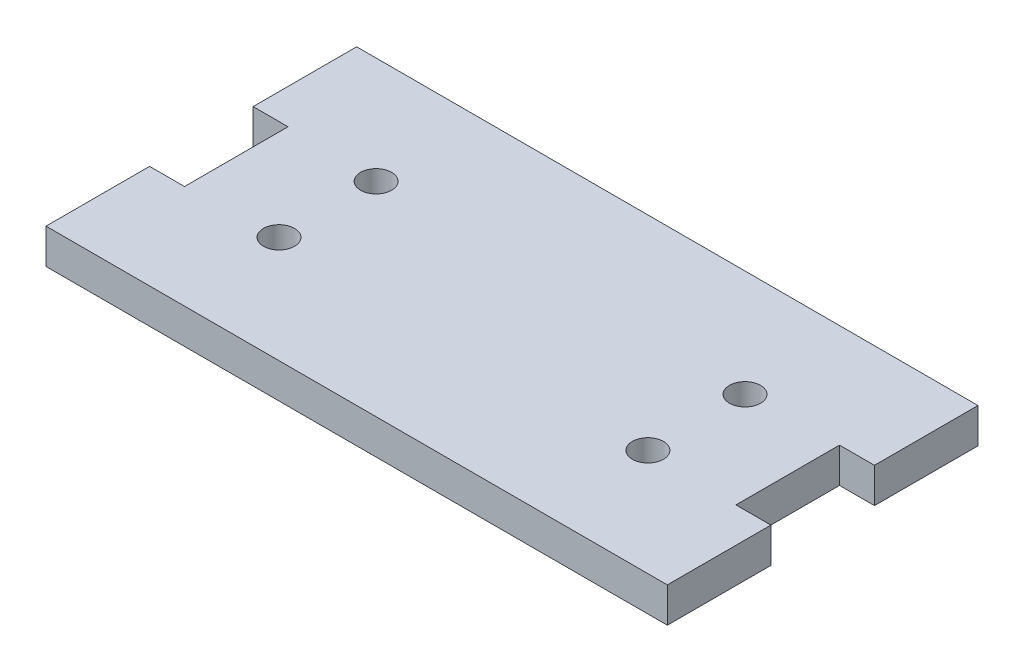
ISO-10303-21;
HEADER;
FILE_DESCRIPTION(('STEP AP214'),'2;1');
FILE_NAME('part.step','',(''),(''),'','','');
FILE_SCHEMA(('AUTOMOTIVE_DESIGN { 1 0 10303 214 1 1 1 1 }'));
ENDSEC;
DATA;
#1=APPLICATION_CONTEXT('core data for automotive mechanical design processes');
#2=APPLICATION_PROTOCOL_DEFINITION('international standard','automotive_design',2000,#1);
#3=PRODUCT_CONTEXT('',#1,'mechanical');
#4=PRODUCT('Part','Part','',(#3));
#5=PRODUCT_RELATED_PRODUCT_CATEGORY('part','',(#4));
#6=PRODUCT_DEFINITION_FORMATION('','',#4);
#7=PRODUCT_DEFINITION_CONTEXT('part definition',#1,'design');
#8=PRODUCT_DEFINITION('design','',#6,#7);
#9=PRODUCT_DEFINITION_SHAPE('','',#8);
#10=(LENGTH_UNIT() NAMED_UNIT(*) SI_UNIT(.MILLI.,.METRE.));
#11=(NAMED_UNIT(*) PLANE_ANGLE_UNIT() SI_UNIT($,.RADIAN.));
#12=(NAMED_UNIT(*) SI_UNIT($,.STERADIAN.) SOLID_ANGLE_UNIT());
#13=UNCERTAINTY_MEASURE_WITH_UNIT(LENGTH_MEASURE(1.E-05),#10,'distance_accuracy_value','');
#14=(GEOMETRIC_REPRESENTATION_CONTEXT(3) GLOBAL_UNCERTAINTY_ASSIGNED_CONTEXT((#13)) GLOBAL_UNIT_ASSIGNED_CONTEXT((#10,
#11,#12)) REPRESENTATION_CONTEXT('',''));
#15=CARTESIAN_POINT('',(0.,0.,0.));
#16=DIRECTION('',(0.,0.,1.));
#17=DIRECTION('',(1.,0.,0.));
#18=AXIS2_PLACEMENT_3D('',#15,#16,#17);
#19=CARTESIAN_POINT('',(151.,9.00000000000001,0.));
#20=DIRECTION('',(1.,0.,0.));
#21=DIRECTION('',(0.,0.,-1.));
#22=AXIS2_PLACEMENT_3D('',#19,#20,#21);
#23=PLANE('',#22);
#24=DIRECTION('',(0.,0.,1.));
#25=VECTOR('',#24,1.);
#26=CARTESIAN_POINT('',(151.,0.,0.));
#27=LINE('',#26,#25);
#28=CARTESIAN_POINT('',(151.,0.,-53.3333333333334));
#29=VERTEX_POINT('',#28);
#30=CARTESIAN_POINT('',(151.,0.,-26.6666666666666));
#31=VERTEX_POINT('',#30);
#32=EDGE_CURVE('E227',#29,#31,#27,.T.);
#33=ORIENTED_EDGE('',*,*,#32,.F.);
#34=DIRECTION('',(0.,-1.,0.));
#35=VECTOR('',#34,1.);
#36=CARTESIAN_POINT('',(151.,9.00000000000001,-53.3333333333334));
#37=LINE('',#36,#35);
#38=CARTESIAN_POINT('',(151.,9.00000000000001,-53.3333333333334));
#39=VERTEX_POINT('',#38);
#40=EDGE_CURVE('E13',#39,#29,#37,.T.);
#41=ORIENTED_EDGE('',*,*,#40,.F.);
#42=DIRECTION('',(0.,0.,1.));
#43=VECTOR('',#42,1.);
#44=CARTESIAN_POINT('',(151.,9.00000000000001,0.));
#45=LINE('',#44,#43);
#46=CARTESIAN_POINT('',(151.,9.00000000000001,-26.6666666666666));
#47=VERTEX_POINT('',#46);
#48=EDGE_CURVE('E365',#39,#47,#45,.T.);
#49=ORIENTED_EDGE('',*,*,#48,.T.);
#50=DIRECTION('',(0.,-1.,0.));
#51=VECTOR('',#50,1.);
#52=CARTESIAN_POINT('',(151.,9.00000000000001,-26.6666666666666));
#53=LINE('',#52,#51);
#54=EDGE_CURVE('E118',#47,#31,#53,.T.);
#55=ORIENTED_EDGE('',*,*,#54,.T.);
#56=EDGE_LOOP('',(#33,#41,#49,#55));
#57=FACE_BOUND('',#56,.T.);
#58=ADVANCED_FACE('F54',(#57),#23,.T.);
#59=CARTESIAN_POINT('',(2.4980018054066E-13,9.00000000000001,-53.3333333333341));
#60=DIRECTION('',(0.,0.,1.));
#61=DIRECTION('',(1.,0.,0.));
#62=AXIS2_PLACEMENT_3D('',#59,#60,#61);
#63=PLANE('',#62);
#64=DIRECTION('',(-1.,0.,0.));
#65=VECTOR('',#64,1.);
#66=CARTESIAN_POINT('',(2.4980018054066E-13,0.,-53.3333333333341));
#67=LINE('',#66,#65);
#68=CARTESIAN_POINT('',(160.,0.,-53.3333333333333));
#69=VERTEX_POINT('',#68);
#70=EDGE_CURVE('E219',#69,#29,#67,.T.);
#71=ORIENTED_EDGE('',*,*,#70,.F.);
#72=DIRECTION('',(0.,-1.,0.));
#73=VECTOR('',#72,1.);
#74=CARTESIAN_POINT('',(160.,9.00000000000001,-53.3333333333333));
#75=LINE('',#74,#73);
#76=CARTESIAN_POINT('',(160.,9.00000000000001,-53.3333333333333));
#77=VERTEX_POINT('',#76);
#78=EDGE_CURVE('E64',#77,#69,#75,.T.);
#79=ORIENTED_EDGE('',*,*,#78,.F.);
#80=DIRECTION('',(-1.,0.,0.));
#81=VECTOR('',#80,1.);
#82=CARTESIAN_POINT('',(2.4980018054066E-13,9.00000000000001,-53.3333333333341));
#83=LINE('',#82,#81);
#84=EDGE_CURVE('E370',#77,#39,#83,.T.);
#85=ORIENTED_EDGE('',*,*,#84,.T.);
#86=ORIENTED_EDGE('',*,*,#40,.T.);
#87=EDGE_LOOP('',(#71,#79,#85,#86));
#88=FACE_BOUND('',#87,.T.);
#89=ADVANCED_FACE('F225',(#88),#63,.T.);
#90=CARTESIAN_POINT('',(160.,9.00000000000001,0.));
#91=DIRECTION('',(-1.,0.,0.));
#92=DIRECTION('',(0.,0.,1.));
#93=AXIS2_PLACEMENT_3D('',#90,#91,#92);
#94=PLANE('',#93);
#95=DIRECTION('',(0.,0.,-1.));
#96=VECTOR('',#95,1.);
#97=CARTESIAN_POINT('',(160.,0.,0.));
#98=LINE('',#97,#96);
#99=CARTESIAN_POINT('',(160.,0.,-80.));
#100=VERTEX_POINT('',#99);
#101=EDGE_CURVE('E209',#69,#100,#98,.T.);
#102=ORIENTED_EDGE('',*,*,#101,.T.);
#103=DIRECTION('',(0.,-1.,0.));
#104=VECTOR('',#103,1.);
#105=CARTESIAN_POINT('',(160.,9.00000000000001,-80.));
#106=LINE('',#105,#104);
#107=CARTESIAN_POINT('',(160.,9.00000000000001,-80.));
#108=VERTEX_POINT('',#107);
#109=EDGE_CURVE('E199',#108,#100,#106,.T.);
#110=ORIENTED_EDGE('',*,*,#109,.F.);
#111=DIRECTION('',(0.,0.,-1.));
#112=VECTOR('',#111,1.);
#113=CARTESIAN_POINT('',(160.,9.00000000000001,0.));
#114=LINE('',#113,#112);
#115=EDGE_CURVE('E211',#77,#108,#114,.T.);
#116=ORIENTED_EDGE('',*,*,#115,.F.);
#117=ORIENTED_EDGE('',*,*,#78,.T.);
#118=EDGE_LOOP('',(#102,#110,#116,#117));
#119=FACE_BOUND('',#118,.T.);
#120=ADVANCED_FACE('F207',(#119),#94,.F.);
#121=CARTESIAN_POINT('',(0.,9.00000000000001,-80.));
#122=DIRECTION('',(0.,0.,-1.));
#123=DIRECTION('',(-1.,0.,0.));
#124=AXIS2_PLACEMENT_3D('',#121,#122,#123);
#125=PLANE('',#124);
#126=DIRECTION('',(1.,0.,0.));
#127=VECTOR('',#126,1.);
#128=CARTESIAN_POINT('',(0.,0.,-80.));
#129=LINE('',#128,#127);
#130=CARTESIAN_POINT('',(0.,0.,-80.));
#131=VERTEX_POINT('',#130);
#132=EDGE_CURVE('E222',#131,#100,#129,.T.);
#133=ORIENTED_EDGE('',*,*,#132,.F.);
#134=DIRECTION('',(0.,-1.,0.));
#135=VECTOR('',#134,1.);
#136=CARTESIAN_POINT('',(0.,9.00000000000001,-80.));
#137=LINE('',#136,#135);
#138=CARTESIAN_POINT('',(0.,9.00000000000001,-80.));
#139=VERTEX_POINT('',#138);
#140=EDGE_CURVE('E196',#139,#131,#137,.T.);
#141=ORIENTED_EDGE('',*,*,#140,.F.);
#142=DIRECTION('',(1.,0.,0.));
#143=VECTOR('',#142,1.);
#144=CARTESIAN_POINT('',(0.,9.00000000000001,-80.));
#145=LINE('',#144,#143);
#146=EDGE_CURVE('E378',#139,#108,#145,.T.);
#147=ORIENTED_EDGE('',*,*,#146,.T.);
#148=ORIENTED_EDGE('',*,*,#109,.T.);
#149=EDGE_LOOP('',(#133,#141,#147,#148));
#150=FACE_BOUND('',#149,.T.);
#151=ADVANCED_FACE('F318',(#150),#125,.T.);
#152=CARTESIAN_POINT('',(0.,9.00000000000001,0.));
#153=DIRECTION('',(-1.,0.,0.));
#154=DIRECTION('',(0.,0.,1.));
#155=AXIS2_PLACEMENT_3D('',#152,#153,#154);
#156=PLANE('',#155);
#157=DIRECTION('',(0.,0.,-1.));
#158=VECTOR('',#157,1.);
#159=CARTESIAN_POINT('',(0.,0.,0.));
#160=LINE('',#159,#158);
#161=CARTESIAN_POINT('',(0.,0.,-53.3333333333333));
#162=VERTEX_POINT('',#161);
#163=EDGE_CURVE('E237',#162,#131,#160,.T.);
#164=ORIENTED_EDGE('',*,*,#163,.F.);
#165=DIRECTION('',(0.,-1.,0.));
#166=VECTOR('',#165,1.);
#167=CARTESIAN_POINT('',(0.,9.00000000000001,-53.3333333333333));
#168=LINE('',#167,#166);
#169=CARTESIAN_POINT('',(0.,9.00000000000001,-53.3333333333333));
#170=VERTEX_POINT('',#169);
#171=EDGE_CURVE('E193',#170,#162,#168,.T.);
#172=ORIENTED_EDGE('',*,*,#171,.F.);
#173=DIRECTION('',(0.,0.,-1.));
#174=VECTOR('',#173,1.);
#175=CARTESIAN_POINT('',(0.,9.00000000000001,0.));
#176=LINE('',#175,#174);
#177=EDGE_CURVE('E382',#170,#139,#176,.T.);
#178=ORIENTED_EDGE('',*,*,#177,.T.);
#179=ORIENTED_EDGE('',*,*,#140,.T.);
#180=EDGE_LOOP('',(#164,#172,#178,#179));
#181=FACE_BOUND('',#180,.T.);
#182=ADVANCED_FACE('F321',(#181),#156,.T.);
#183=CARTESIAN_POINT('',(0.,9.00000000000001,-53.3333333333333));
#184=DIRECTION('',(0.,0.,-1.));
#185=DIRECTION('',(-1.,0.,0.));
#186=AXIS2_PLACEMENT_3D('',#183,#184,#185);
#187=PLANE('',#186);
#188=DIRECTION('',(1.,0.,0.));
#189=VECTOR('',#188,1.);
#190=CARTESIAN_POINT('',(0.,0.,-53.3333333333333));
#191=LINE('',#190,#189);
#192=CARTESIAN_POINT('',(9.00000000000001,0.,-53.3333333333333));
#193=VERTEX_POINT('',#192);
#194=EDGE_CURVE('E240',#162,#193,#191,.T.);
#195=ORIENTED_EDGE('',*,*,#194,.T.);
#196=DIRECTION('',(0.,-1.,0.));
#197=VECTOR('',#196,1.);
#198=CARTESIAN_POINT('',(9.00000000000001,9.00000000000001,-53.3333333333333));
#199=LINE('',#198,#197);
#200=CARTESIAN_POINT('',(9.00000000000001,9.00000000000001,-53.3333333333333));
#201=VERTEX_POINT('',#200);
#202=EDGE_CURVE('E189',#201,#193,#199,.T.);
#203=ORIENTED_EDGE('',*,*,#202,.F.);
#204=DIRECTION('',(1.,0.,0.));
#205=VECTOR('',#204,1.);
#206=CARTESIAN_POINT('',(0.,9.00000000000001,-53.3333333333333));
#207=LINE('',#206,#205);
#208=EDGE_CURVE('E386',#170,#201,#207,.T.);
#209=ORIENTED_EDGE('',*,*,#208,.F.);
#210=ORIENTED_EDGE('',*,*,#171,.T.);
#211=EDGE_LOOP('',(#195,#203,#209,#210));
#212=FACE_BOUND('',#211,.T.);
#213=ADVANCED_FACE('F325',(#212),#187,.F.);
#214=CARTESIAN_POINT('',(9.00000000000001,9.00000000000001,0.));
#215=DIRECTION('',(1.,0.,0.));
#216=DIRECTION('',(0.,0.,-1.));
#217=AXIS2_PLACEMENT_3D('',#214,#215,#216);
#218=PLANE('',#217);
#219=DIRECTION('',(0.,0.,1.));
#220=VECTOR('',#219,1.);
#221=CARTESIAN_POINT('',(9.00000000000001,0.,0.));
#222=LINE('',#221,#220);
#223=CARTESIAN_POINT('',(9.00000000000001,0.,-26.6666666666667));
#224=VERTEX_POINT('',#223);
#225=EDGE_CURVE('E244',#193,#224,#222,.T.);
#226=ORIENTED_EDGE('',*,*,#225,.T.);
#227=DIRECTION('',(0.,-1.,0.));
#228=VECTOR('',#227,1.);
#229=CARTESIAN_POINT('',(9.00000000000001,9.00000000000001,-26.6666666666667));
#230=LINE('',#229,#228);
#231=CARTESIAN_POINT('',(9.00000000000001,9.00000000000001,-26.6666666666667));
#232=VERTEX_POINT('',#231);
#233=EDGE_CURVE('E186',#232,#224,#230,.T.);
#234=ORIENTED_EDGE('',*,*,#233,.F.);
#235=DIRECTION('',(0.,0.,1.));
#236=VECTOR('',#235,1.);
#237=CARTESIAN_POINT('',(9.00000000000001,9.00000000000001,0.));
#238=LINE('',#237,#236);
#239=EDGE_CURVE('E390',#201,#232,#238,.T.);
#240=ORIENTED_EDGE('',*,*,#239,.F.);
#241=ORIENTED_EDGE('',*,*,#202,.T.);
#242=EDGE_LOOP('',(#226,#234,#240,#241));
#243=FACE_BOUND('',#242,.T.);
#244=ADVANCED_FACE('F329',(#243),#218,.F.);
#245=CARTESIAN_POINT('',(0.,9.00000000000001,-26.6666666666667));
#246=DIRECTION('',(0.,0.,-1.));
#247=DIRECTION('',(-1.,0.,0.));
#248=AXIS2_PLACEMENT_3D('',#245,#246,#247);
#249=PLANE('',#248);
#250=DIRECTION('',(1.,0.,0.));
#251=VECTOR('',#250,1.);
#252=CARTESIAN_POINT('',(0.,0.,-26.6666666666667));
#253=LINE('',#252,#251);
#254=CARTESIAN_POINT('',(0.,0.,-26.6666666666667));
#255=VERTEX_POINT('',#254);
#256=EDGE_CURVE('E248',#255,#224,#253,.T.);
#257=ORIENTED_EDGE('',*,*,#256,.F.);
#258=DIRECTION('',(0.,-1.,0.));
#259=VECTOR('',#258,1.);
#260=CARTESIAN_POINT('',(0.,9.00000000000001,-26.6666666666667));
#261=LINE('',#260,#259);
#262=CARTESIAN_POINT('',(0.,9.00000000000001,-26.6666666666667));
#263=VERTEX_POINT('',#262);
#264=EDGE_CURVE('E179',#263,#255,#261,.T.);
#265=ORIENTED_EDGE('',*,*,#264,.F.);
#266=DIRECTION('',(1.,0.,0.));
#267=VECTOR('',#266,1.);
#268=CARTESIAN_POINT('',(0.,9.00000000000001,-26.6666666666667));
#269=LINE('',#268,#267);
#270=EDGE_CURVE('E393',#263,#232,#269,.T.);
#271=ORIENTED_EDGE('',*,*,#270,.T.);
#272=ORIENTED_EDGE('',*,*,#233,.T.);
#273=EDGE_LOOP('',(#257,#265,#271,#272));
#274=FACE_BOUND('',#273,.T.);
#275=ADVANCED_FACE('F333',(#274),#249,.T.);
#276=CARTESIAN_POINT('',(0.,9.00000000000001,0.));
#277=DIRECTION('',(-1.,0.,0.));
#278=DIRECTION('',(0.,0.,1.));
#279=AXIS2_PLACEMENT_3D('',#276,#277,#278);
#280=PLANE('',#279);
#281=DIRECTION('',(0.,0.,-1.));
#282=VECTOR('',#281,1.);
#283=CARTESIAN_POINT('',(0.,0.,0.));
#284=LINE('',#283,#282);
#285=CARTESIAN_POINT('',(0.,0.,0.));
#286=VERTEX_POINT('',#285);
#287=EDGE_CURVE('E252',#286,#255,#284,.T.);
#288=ORIENTED_EDGE('',*,*,#287,.F.);
#289=DIRECTION('',(0.,-1.,0.));
#290=VECTOR('',#289,1.);
#291=CARTESIAN_POINT('',(0.,9.00000000000001,0.));
#292=LINE('',#291,#290);
#293=CARTESIAN_POINT('',(0.,9.00000000000001,0.));
#294=VERTEX_POINT('',#293);
#295=EDGE_CURVE('E174',#294,#286,#292,.T.);
#296=ORIENTED_EDGE('',*,*,#295,.F.);
#297=DIRECTION('',(0.,0.,-1.));
#298=VECTOR('',#297,1.);
#299=CARTESIAN_POINT('',(0.,9.00000000000001,0.));
#300=LINE('',#299,#298);
#301=EDGE_CURVE('E166',#294,#263,#300,.T.);
#302=ORIENTED_EDGE('',*,*,#301,.T.);
#303=ORIENTED_EDGE('',*,*,#264,.T.);
#304=EDGE_LOOP('',(#288,#296,#302,#303));
#305=FACE_BOUND('',#304,.T.);
#306=ADVANCED_FACE('F337',(#305),#280,.T.);
#307=CARTESIAN_POINT('',(0.,9.00000000000001,0.));
#308=DIRECTION('',(0.,0.,-1.));
#309=DIRECTION('',(-1.,0.,0.));
#310=AXIS2_PLACEMENT_3D('',#307,#308,#309);
#311=PLANE('',#310);
#312=DIRECTION('',(1.,0.,0.));
#313=VECTOR('',#312,1.);
#314=CARTESIAN_POINT('',(0.,0.,0.));
#315=LINE('',#314,#313);
#316=CARTESIAN_POINT('',(160.,0.,0.));
#317=VERTEX_POINT('',#316);
#318=EDGE_CURVE('E172',#286,#317,#315,.T.);
#319=ORIENTED_EDGE('',*,*,#318,.T.);
#320=DIRECTION('',(0.,-1.,0.));
#321=VECTOR('',#320,1.);
#322=CARTESIAN_POINT('',(160.,9.00000000000001,0.));
#323=LINE('',#322,#321);
#324=CARTESIAN_POINT('',(160.,9.00000000000001,0.));
#325=VERTEX_POINT('',#324);
#326=EDGE_CURVE('E154',#325,#317,#323,.T.);
#327=ORIENTED_EDGE('',*,*,#326,.F.);
#328=DIRECTION('',(1.,0.,0.));
#329=VECTOR('',#328,1.);
#330=CARTESIAN_POINT('',(0.,9.00000000000001,0.));
#331=LINE('',#330,#329);
#332=EDGE_CURVE('E158',#294,#325,#331,.T.);
#333=ORIENTED_EDGE('',*,*,#332,.F.);
#334=ORIENTED_EDGE('',*,*,#295,.T.);
#335=EDGE_LOOP('',(#319,#327,#333,#334));
#336=FACE_BOUND('',#335,.T.);
#337=ADVANCED_FACE('F170',(#336),#311,.F.);
#338=CARTESIAN_POINT('',(160.,9.00000000000001,0.));
#339=DIRECTION('',(-1.,0.,0.));
#340=DIRECTION('',(0.,0.,1.));
#341=AXIS2_PLACEMENT_3D('',#338,#339,#340);
#342=PLANE('',#341);
#343=DIRECTION('',(0.,0.,-1.));
#344=VECTOR('',#343,1.);
#345=CARTESIAN_POINT('',(160.,0.,0.));
#346=LINE('',#345,#344);
#347=CARTESIAN_POINT('',(160.,0.,-26.6666666666667));
#348=VERTEX_POINT('',#347);
#349=EDGE_CURVE('E258',#317,#348,#346,.T.);
#350=ORIENTED_EDGE('',*,*,#349,.T.);
#351=DIRECTION('',(0.,-1.,0.));
#352=VECTOR('',#351,1.);
#353=CARTESIAN_POINT('',(160.,9.00000000000001,-26.6666666666667));
#354=LINE('',#353,#352);
#355=CARTESIAN_POINT('',(160.,9.00000000000001,-26.6666666666667));
#356=VERTEX_POINT('',#355);
#357=EDGE_CURVE('E156',#356,#348,#354,.T.);
#358=ORIENTED_EDGE('',*,*,#357,.F.);
#359=DIRECTION('',(0.,0.,-1.));
#360=VECTOR('',#359,1.);
#361=CARTESIAN_POINT('',(160.,9.00000000000001,0.));
#362=LINE('',#361,#360);
#363=EDGE_CURVE('E149',#325,#356,#362,.T.);
#364=ORIENTED_EDGE('',*,*,#363,.F.);
#365=ORIENTED_EDGE('',*,*,#326,.T.);
#366=EDGE_LOOP('',(#350,#358,#364,#365));
#367=FACE_BOUND('',#366,.T.);
#368=ADVANCED_FACE('F152',(#367),#342,.F.);
#369=CARTESIAN_POINT('',(127.5,9.00000000000001,-27.5));
#370=DIRECTION('',(0.,-1.,0.));
#371=DIRECTION('',(0.,0.,-1.));
#372=AXIS2_PLACEMENT_3D('',#369,#370,#371);
#373=CYLINDRICAL_SURFACE('',#372,4.00000000000001);
#374=CARTESIAN_POINT('',(127.5,9.00000000000001,-27.5));
#375=DIRECTION('',(0.,1.,0.));
#376=DIRECTION('',(0.,0.,1.));
#377=AXIS2_PLACEMENT_3D('',#374,#375,#376);
#378=CIRCLE('',#377,4.00000000000001);
#379=CARTESIAN_POINT('',(127.5,9.00000000000001,-23.5));
#380=VERTEX_POINT('',#379);
#381=EDGE_CURVE('E276',#380,#380,#378,.T.);
#382=ORIENTED_EDGE('',*,*,#381,.T.);
#383=EDGE_LOOP('',(#382));
#384=FACE_BOUND('',#383,.T.);
#385=CARTESIAN_POINT('',(127.5,0.,-27.5));
#386=DIRECTION('',(0.,1.,0.));
#387=DIRECTION('',(0.,0.,1.));
#388=AXIS2_PLACEMENT_3D('',#385,#386,#387);
#389=CIRCLE('',#388,4.00000000000001);
#390=CARTESIAN_POINT('',(127.5,0.,-23.5));
#391=VERTEX_POINT('',#390);
#392=EDGE_CURVE('E263',#391,#391,#389,.T.);
#393=ORIENTED_EDGE('',*,*,#392,.F.);
#394=EDGE_LOOP('',(#393));
#395=FACE_BOUND('',#394,.T.);
#396=ADVANCED_FACE('F305',(#384,#395),#373,.F.);
#397=CARTESIAN_POINT('',(-1.2490009027033E-13,9.00000000000001,-26.6666666666659));
#398=DIRECTION('',(0.,0.,1.));
#399=DIRECTION('',(1.,0.,0.));
#400=AXIS2_PLACEMENT_3D('',#397,#398,#399);
#401=PLANE('',#400);
#402=DIRECTION('',(-1.,0.,0.));
#403=VECTOR('',#402,1.);
#404=CARTESIAN_POINT('',(-1.2490009027033E-13,0.,-26.6666666666659));
#405=LINE('',#404,#403);
#406=EDGE_CURVE('E111',#348,#31,#405,.T.);
#407=ORIENTED_EDGE('',*,*,#406,.T.);
#408=ORIENTED_EDGE('',*,*,#54,.F.);
#409=DIRECTION('',(-1.,0.,0.));
#410=VECTOR('',#409,1.);
#411=CARTESIAN_POINT('',(-1.2490009027033E-13,9.00000000000001,-26.6666666666659));
#412=LINE('',#411,#410);
#413=EDGE_CURVE('E72',#356,#47,#412,.T.);
#414=ORIENTED_EDGE('',*,*,#413,.F.);
#415=ORIENTED_EDGE('',*,*,#357,.T.);
#416=EDGE_LOOP('',(#407,#408,#414,#415));
#417=FACE_BOUND('',#416,.T.);
#418=ADVANCED_FACE('F297',(#417),#401,.F.);
#419=CARTESIAN_POINT('',(32.5,9.00000000000001,-52.5));
#420=DIRECTION('',(0.,-1.,0.));
#421=DIRECTION('',(0.,0.,-1.));
#422=AXIS2_PLACEMENT_3D('',#419,#420,#421);
#423=CYLINDRICAL_SURFACE('',#422,4.00000000000001);
#424=CARTESIAN_POINT('',(32.5,9.00000000000001,-52.5));
#425=DIRECTION('',(0.,1.,0.));
#426=DIRECTION('',(0.,0.,1.));
#427=AXIS2_PLACEMENT_3D('',#424,#425,#426);
#428=CIRCLE('',#427,4.00000000000001);
#429=CARTESIAN_POINT('',(32.5,9.00000000000001,-48.5));
#430=VERTEX_POINT('',#429);
#431=EDGE_CURVE('E363',#430,#430,#428,.T.);
#432=ORIENTED_EDGE('',*,*,#431,.T.);
#433=EDGE_LOOP('',(#432));
#434=FACE_BOUND('',#433,.T.);
#435=CARTESIAN_POINT('',(32.5,0.,-52.5));
#436=DIRECTION('',(0.,1.,0.));
#437=DIRECTION('',(0.,0.,1.));
#438=AXIS2_PLACEMENT_3D('',#435,#436,#437);
#439=CIRCLE('',#438,4.00000000000001);
#440=CARTESIAN_POINT('',(32.5,0.,-48.5));
#441=VERTEX_POINT('',#440);
#442=EDGE_CURVE('E231',#441,#441,#439,.T.);
#443=ORIENTED_EDGE('',*,*,#442,.F.);
#444=EDGE_LOOP('',(#443));
#445=FACE_BOUND('',#444,.T.);
#446=ADVANCED_FACE('F295',(#434,#445),#423,.F.);
#447=CARTESIAN_POINT('',(32.5,9.00000000000001,-27.5));
#448=DIRECTION('',(0.,-1.,0.));
#449=DIRECTION('',(0.,0.,-1.));
#450=AXIS2_PLACEMENT_3D('',#447,#448,#449);
#451=CYLINDRICAL_SURFACE('',#450,4.00000000000001);
#452=CARTESIAN_POINT('',(32.5,9.00000000000001,-27.5));
#453=DIRECTION('',(0.,1.,0.));
#454=DIRECTION('',(0.,0.,1.));
#455=AXIS2_PLACEMENT_3D('',#452,#453,#454);
#456=CIRCLE('',#455,4.00000000000001);
#457=CARTESIAN_POINT('',(32.5,9.00000000000001,-23.5));
#458=VERTEX_POINT('',#457);
#459=EDGE_CURVE('E270',#458,#458,#456,.F.);
#460=ORIENTED_EDGE('',*,*,#459,.F.);
#461=EDGE_LOOP('',(#460));
#462=FACE_BOUND('',#461,.T.);
#463=CARTESIAN_POINT('',(32.5,0.,-27.5));
#464=DIRECTION('',(0.,1.,0.));
#465=DIRECTION('',(0.,0.,1.));
#466=AXIS2_PLACEMENT_3D('',#463,#464,#465);
#467=CIRCLE('',#466,4.00000000000001);
#468=CARTESIAN_POINT('',(32.5,0.,-23.5));
#469=VERTEX_POINT('',#468);
#470=EDGE_CURVE('E286',#469,#469,#467,.F.);
#471=ORIENTED_EDGE('',*,*,#470,.T.);
#472=EDGE_LOOP('',(#471));
#473=FACE_BOUND('',#472,.T.);
#474=ADVANCED_FACE('F56',(#462,#473),#451,.F.);
#475=CARTESIAN_POINT('',(127.5,9.00000000000001,-52.5));
#476=DIRECTION('',(0.,-1.,0.));
#477=DIRECTION('',(0.,0.,-1.));
#478=AXIS2_PLACEMENT_3D('',#475,#476,#477);
#479=CYLINDRICAL_SURFACE('',#478,4.00000000000001);
#480=CARTESIAN_POINT('',(127.5,9.00000000000001,-52.5));
#481=DIRECTION('',(0.,1.,0.));
#482=DIRECTION('',(0.,0.,1.));
#483=AXIS2_PLACEMENT_3D('',#480,#481,#482);
#484=CIRCLE('',#483,4.00000000000001);
#485=CARTESIAN_POINT('',(127.5,9.00000000000001,-48.5));
#486=VERTEX_POINT('',#485);
#487=EDGE_CURVE('E272',#486,#486,#484,.F.);
#488=ORIENTED_EDGE('',*,*,#487,.F.);
#489=EDGE_LOOP('',(#488));
#490=FACE_BOUND('',#489,.T.);
#491=CARTESIAN_POINT('',(127.5,0.,-52.5));
#492=DIRECTION('',(0.,1.,0.));
#493=DIRECTION('',(0.,0.,1.));
#494=AXIS2_PLACEMENT_3D('',#491,#492,#493);
#495=CIRCLE('',#494,4.00000000000001);
#496=CARTESIAN_POINT('',(127.5,0.,-48.5));
#497=VERTEX_POINT('',#496);
#498=EDGE_CURVE('E267',#497,#497,#495,.F.);
#499=ORIENTED_EDGE('',*,*,#498,.T.);
#500=EDGE_LOOP('',(#499));
#501=FACE_BOUND('',#500,.T.);
#502=ADVANCED_FACE('F303',(#490,#501),#479,.F.);
#503=CARTESIAN_POINT('',(0.,9.00000000000001,0.));
#504=DIRECTION('',(0.,1.,0.));
#505=DIRECTION('',(0.,0.,1.));
#506=AXIS2_PLACEMENT_3D('',#503,#504,#505);
#507=PLANE('',#506);
#508=ORIENTED_EDGE('',*,*,#459,.T.);
#509=EDGE_LOOP('',(#508));
#510=FACE_BOUND('',#509,.T.);
#511=ORIENTED_EDGE('',*,*,#431,.F.);
#512=EDGE_LOOP('',(#511));
#513=FACE_BOUND('',#512,.T.);
#514=ORIENTED_EDGE('',*,*,#48,.F.);
#515=ORIENTED_EDGE('',*,*,#84,.F.);
#516=ORIENTED_EDGE('',*,*,#115,.T.);
#517=ORIENTED_EDGE('',*,*,#146,.F.);
#518=ORIENTED_EDGE('',*,*,#177,.F.);
#519=ORIENTED_EDGE('',*,*,#208,.T.);
#520=ORIENTED_EDGE('',*,*,#239,.T.);
#521=ORIENTED_EDGE('',*,*,#270,.F.);
#522=ORIENTED_EDGE('',*,*,#301,.F.);
#523=ORIENTED_EDGE('',*,*,#332,.T.);
#524=ORIENTED_EDGE('',*,*,#363,.T.);
#525=ORIENTED_EDGE('',*,*,#413,.T.);
#526=EDGE_LOOP('',(#514,#515,#516,#517,#518,#519,#520,#521,#522,#523,#524,#525));
#527=FACE_BOUND('',#526,.T.);
#528=ORIENTED_EDGE('',*,*,#381,.F.);
#529=EDGE_LOOP('',(#528));
#530=FACE_BOUND('',#529,.T.);
#531=ORIENTED_EDGE('',*,*,#487,.T.);
#532=EDGE_LOOP('',(#531));
#533=FACE_BOUND('',#532,.T.);
#534=ADVANCED_FACE('F162',(#510,#513,#527,#530,#533),#507,.T.);
#535=CARTESIAN_POINT('',(0.,0.,0.));
#536=DIRECTION('',(0.,1.,0.));
#537=DIRECTION('',(0.,0.,1.));
#538=AXIS2_PLACEMENT_3D('',#535,#536,#537);
#539=PLANE('',#538);
#540=ORIENTED_EDGE('',*,*,#470,.F.);
#541=EDGE_LOOP('',(#540));
#542=FACE_BOUND('',#541,.T.);
#543=ORIENTED_EDGE('',*,*,#442,.T.);
#544=EDGE_LOOP('',(#543));
#545=FACE_BOUND('',#544,.T.);
#546=ORIENTED_EDGE('',*,*,#32,.T.);
#547=ORIENTED_EDGE('',*,*,#406,.F.);
#548=ORIENTED_EDGE('',*,*,#349,.F.);
#549=ORIENTED_EDGE('',*,*,#318,.F.);
#550=ORIENTED_EDGE('',*,*,#287,.T.);
#551=ORIENTED_EDGE('',*,*,#256,.T.);
#552=ORIENTED_EDGE('',*,*,#225,.F.);
#553=ORIENTED_EDGE('',*,*,#194,.F.);
#554=ORIENTED_EDGE('',*,*,#163,.T.);
#555=ORIENTED_EDGE('',*,*,#132,.T.);
#556=ORIENTED_EDGE('',*,*,#101,.F.);
#557=ORIENTED_EDGE('',*,*,#70,.T.);
#558=EDGE_LOOP('',(#546,#547,#548,#549,#550,#551,#552,#553,#554,#555,#556,#557));
#559=FACE_BOUND('',#558,.T.);
#560=ORIENTED_EDGE('',*,*,#392,.T.);
#561=EDGE_LOOP('',(#560));
#562=FACE_BOUND('',#561,.T.);
#563=ORIENTED_EDGE('',*,*,#498,.F.);
#564=EDGE_LOOP('',(#563));
#565=FACE_BOUND('',#564,.T.);
#566=ADVANCED_FACE('F217',(#542,#545,#559,#562,#565),#539,.F.);
#567=CLOSED_SHELL('',(#58,#89,#120,#151,#182,#213,#244,#275,#306,#337,#368,#396,#418,#446,#474,
#502,#534,#566));
#568=MANIFOLD_SOLID_BREP('B2',#567);
#569=ADVANCED_BREP_SHAPE_REPRESENTATION('',(#18,#568),#14);
#570=SHAPE_DEFINITION_REPRESENTATION(#9,#569);
ENDSEC;
END-ISO-10303-21;
